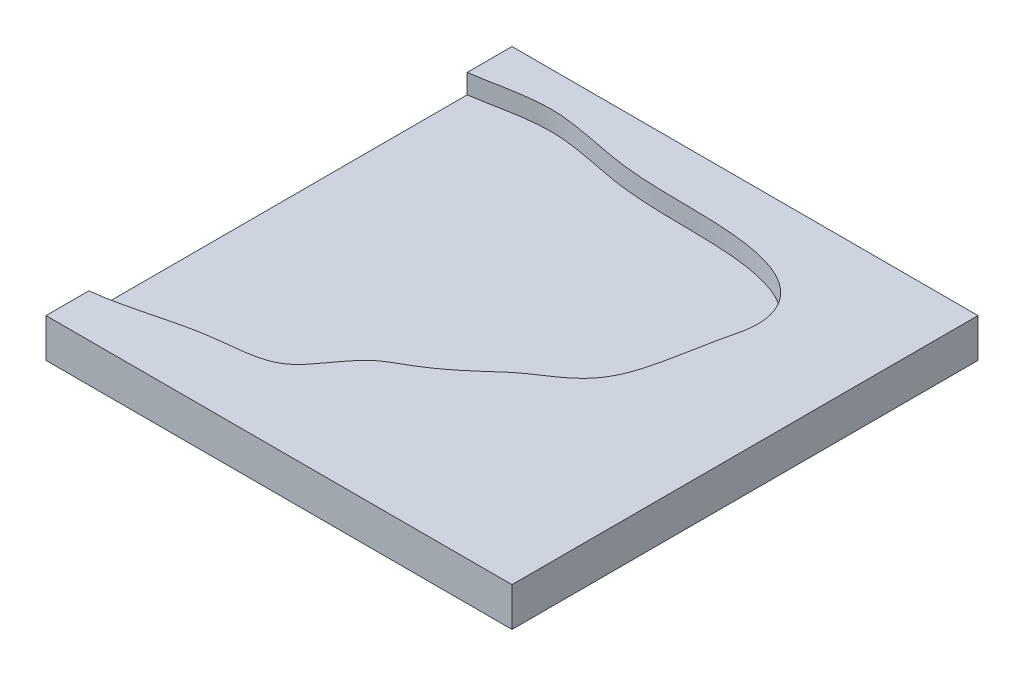
ISO-10303-21;
HEADER;
FILE_DESCRIPTION(('STEP AP214'),'2;1');
FILE_NAME('part.step','',(''),(''),'','','');
FILE_SCHEMA(('AUTOMOTIVE_DESIGN { 1 0 10303 214 1 1 1 1 }'));
ENDSEC;
DATA;
#1=APPLICATION_CONTEXT('core data for automotive mechanical design processes');
#2=APPLICATION_PROTOCOL_DEFINITION('international standard','automotive_design',2000,#1);
#3=PRODUCT_CONTEXT('',#1,'mechanical');
#4=PRODUCT('Part','Part','',(#3));
#5=PRODUCT_RELATED_PRODUCT_CATEGORY('part','',(#4));
#6=PRODUCT_DEFINITION_FORMATION('','',#4);
#7=PRODUCT_DEFINITION_CONTEXT('part definition',#1,'design');
#8=PRODUCT_DEFINITION('design','',#6,#7);
#9=PRODUCT_DEFINITION_SHAPE('','',#8);
#10=(LENGTH_UNIT() NAMED_UNIT(*) SI_UNIT(.MILLI.,.METRE.));
#11=(NAMED_UNIT(*) PLANE_ANGLE_UNIT() SI_UNIT($,.RADIAN.));
#12=(NAMED_UNIT(*) SI_UNIT($,.STERADIAN.) SOLID_ANGLE_UNIT());
#13=UNCERTAINTY_MEASURE_WITH_UNIT(LENGTH_MEASURE(1.E-05),#10,'distance_accuracy_value','');
#14=(GEOMETRIC_REPRESENTATION_CONTEXT(3) GLOBAL_UNCERTAINTY_ASSIGNED_CONTEXT((#13)) GLOBAL_UNIT_ASSIGNED_CONTEXT((#10,
#11,#12)) REPRESENTATION_CONTEXT('',''));
#15=CARTESIAN_POINT('',(0.,0.,0.));
#16=DIRECTION('',(0.,0.,1.));
#17=DIRECTION('',(1.,0.,0.));
#18=AXIS2_PLACEMENT_3D('',#15,#16,#17);
#19=CARTESIAN_POINT('',(-2.6638595554184,10.,149.689917766277));
#20=DIRECTION('',(1.,0.,0.));
#21=DIRECTION('',(0.,0.,-1.));
#22=AXIS2_PLACEMENT_3D('',#19,#20,#21);
#23=PLANE('',#22);
#24=DIRECTION('',(0.,0.,1.));
#25=VECTOR('',#24,1.);
#26=CARTESIAN_POINT('',(-2.6638595554184,10.,149.689917766277));
#27=LINE('',#26,#25);
#28=CARTESIAN_POINT('',(-2.6638595554184,10.,138.643920271503));
#29=VERTEX_POINT('',#28);
#30=CARTESIAN_POINT('',(-2.6638595554184,10.,149.689917766277));
#31=VERTEX_POINT('',#30);
#32=EDGE_CURVE('E89',#29,#31,#27,.T.);
#33=ORIENTED_EDGE('',*,*,#32,.F.);
#34=DIRECTION('',(0.,1.,0.));
#35=VECTOR('',#34,1.);
#36=CARTESIAN_POINT('',(-2.6638595554184,5.,138.643920271503));
#37=LINE('',#36,#35);
#38=CARTESIAN_POINT('',(-2.6638595554184,5.,138.643920271503));
#39=VERTEX_POINT('',#38);
#40=EDGE_CURVE('E53',#39,#29,#37,.T.);
#41=ORIENTED_EDGE('',*,*,#40,.F.);
#42=DIRECTION('',(0.,0.,1.));
#43=VECTOR('',#42,1.);
#44=CARTESIAN_POINT('',(-2.6638595554184,5.,41.2210328084652));
#45=LINE('',#44,#43);
#46=CARTESIAN_POINT('',(-2.6638595554184,5.,41.2210328084652));
#47=VERTEX_POINT('',#46);
#48=EDGE_CURVE('E137',#47,#39,#45,.T.);
#49=ORIENTED_EDGE('',*,*,#48,.F.);
#50=DIRECTION('',(0.,1.,0.));
#51=VECTOR('',#50,1.);
#52=CARTESIAN_POINT('',(-2.6638595554184,5.,41.2210328084652));
#53=LINE('',#52,#51);
#54=CARTESIAN_POINT('',(-2.6638595554184,10.,41.2210328084652));
#55=VERTEX_POINT('',#54);
#56=EDGE_CURVE('E206',#47,#55,#53,.T.);
#57=ORIENTED_EDGE('',*,*,#56,.T.);
#58=CARTESIAN_POINT('',(-2.6638595554184,10.,29.6899177662766));
#59=VERTEX_POINT('',#58);
#60=EDGE_CURVE('E214',#59,#55,#27,.T.);
#61=ORIENTED_EDGE('',*,*,#60,.F.);
#62=DIRECTION('',(0.,-1.,0.));
#63=VECTOR('',#62,1.);
#64=CARTESIAN_POINT('',(-2.6638595554184,10.,29.6899177662766));
#65=LINE('',#64,#63);
#66=CARTESIAN_POINT('',(-2.6638595554184,0.,29.6899177662766));
#67=VERTEX_POINT('',#66);
#68=EDGE_CURVE('E193',#59,#67,#65,.T.);
#69=ORIENTED_EDGE('',*,*,#68,.T.);
#70=DIRECTION('',(0.,0.,1.));
#71=VECTOR('',#70,1.);
#72=CARTESIAN_POINT('',(-2.6638595554184,0.,149.689917766277));
#73=LINE('',#72,#71);
#74=CARTESIAN_POINT('',(-2.6638595554184,0.,149.689917766277));
#75=VERTEX_POINT('',#74);
#76=EDGE_CURVE('E181',#67,#75,#73,.T.);
#77=ORIENTED_EDGE('',*,*,#76,.T.);
#78=DIRECTION('',(0.,-1.,0.));
#79=VECTOR('',#78,1.);
#80=CARTESIAN_POINT('',(-2.6638595554184,10.,149.689917766277));
#81=LINE('',#80,#79);
#82=EDGE_CURVE('E11',#31,#75,#81,.T.);
#83=ORIENTED_EDGE('',*,*,#82,.F.);
#84=EDGE_LOOP('',(#33,#41,#49,#57,#61,#69,#77,#83));
#85=FACE_BOUND('',#84,.T.);
#86=ADVANCED_FACE('F38',(#85),#23,.F.);
#87=CARTESIAN_POINT('',(117.336140444582,10.,149.689917766277));
#88=DIRECTION('',(0.,0.,-1.));
#89=DIRECTION('',(-1.,0.,0.));
#90=AXIS2_PLACEMENT_3D('',#87,#88,#89);
#91=PLANE('',#90);
#92=DIRECTION('',(1.,0.,0.));
#93=VECTOR('',#92,1.);
#94=CARTESIAN_POINT('',(117.336140444582,0.,149.689917766277));
#95=LINE('',#94,#93);
#96=CARTESIAN_POINT('',(117.336140444582,0.,149.689917766277));
#97=VERTEX_POINT('',#96);
#98=EDGE_CURVE('E171',#75,#97,#95,.T.);
#99=ORIENTED_EDGE('',*,*,#98,.T.);
#100=DIRECTION('',(0.,-1.,0.));
#101=VECTOR('',#100,1.);
#102=CARTESIAN_POINT('',(117.336140444582,10.,149.689917766277));
#103=LINE('',#102,#101);
#104=CARTESIAN_POINT('',(117.336140444582,10.,149.689917766277));
#105=VERTEX_POINT('',#104);
#106=EDGE_CURVE('E46',#105,#97,#103,.T.);
#107=ORIENTED_EDGE('',*,*,#106,.F.);
#108=DIRECTION('',(1.,0.,0.));
#109=VECTOR('',#108,1.);
#110=CARTESIAN_POINT('',(117.336140444582,10.,149.689917766277));
#111=LINE('',#110,#109);
#112=EDGE_CURVE('E201',#31,#105,#111,.T.);
#113=ORIENTED_EDGE('',*,*,#112,.F.);
#114=ORIENTED_EDGE('',*,*,#82,.T.);
#115=EDGE_LOOP('',(#99,#107,#113,#114));
#116=FACE_BOUND('',#115,.T.);
#117=ADVANCED_FACE('F161',(#116),#91,.F.);
#118=CARTESIAN_POINT('',(117.336140444582,10.,29.6899177662766));
#119=DIRECTION('',(-1.,0.,0.));
#120=DIRECTION('',(0.,0.,1.));
#121=AXIS2_PLACEMENT_3D('',#118,#119,#120);
#122=PLANE('',#121);
#123=DIRECTION('',(0.,0.,-1.));
#124=VECTOR('',#123,1.);
#125=CARTESIAN_POINT('',(117.336140444582,0.,29.6899177662766));
#126=LINE('',#125,#124);
#127=CARTESIAN_POINT('',(117.336140444582,0.,29.6899177662766));
#128=VERTEX_POINT('',#127);
#129=EDGE_CURVE('E180',#97,#128,#126,.T.);
#130=ORIENTED_EDGE('',*,*,#129,.T.);
#131=DIRECTION('',(0.,-1.,0.));
#132=VECTOR('',#131,1.);
#133=CARTESIAN_POINT('',(117.336140444582,10.,29.6899177662766));
#134=LINE('',#133,#132);
#135=CARTESIAN_POINT('',(117.336140444582,10.,29.6899177662766));
#136=VERTEX_POINT('',#135);
#137=EDGE_CURVE('E186',#136,#128,#134,.T.);
#138=ORIENTED_EDGE('',*,*,#137,.F.);
#139=DIRECTION('',(0.,0.,-1.));
#140=VECTOR('',#139,1.);
#141=CARTESIAN_POINT('',(117.336140444582,10.,29.6899177662766));
#142=LINE('',#141,#140);
#143=EDGE_CURVE('E184',#105,#136,#142,.T.);
#144=ORIENTED_EDGE('',*,*,#143,.F.);
#145=ORIENTED_EDGE('',*,*,#106,.T.);
#146=EDGE_LOOP('',(#130,#138,#144,#145));
#147=FACE_BOUND('',#146,.T.);
#148=ADVANCED_FACE('F159',(#147),#122,.F.);
#149=CARTESIAN_POINT('',(-2.6638595554184,10.,29.6899177662766));
#150=DIRECTION('',(0.,0.,1.));
#151=DIRECTION('',(1.,0.,0.));
#152=AXIS2_PLACEMENT_3D('',#149,#150,#151);
#153=PLANE('',#152);
#154=DIRECTION('',(-1.,0.,0.));
#155=VECTOR('',#154,1.);
#156=CARTESIAN_POINT('',(-2.6638595554184,0.,29.6899177662766));
#157=LINE('',#156,#155);
#158=EDGE_CURVE('E83',#128,#67,#157,.T.);
#159=ORIENTED_EDGE('',*,*,#158,.T.);
#160=ORIENTED_EDGE('',*,*,#68,.F.);
#161=DIRECTION('',(-1.,0.,0.));
#162=VECTOR('',#161,1.);
#163=CARTESIAN_POINT('',(-2.6638595554184,10.,29.6899177662766));
#164=LINE('',#163,#162);
#165=EDGE_CURVE('E62',#136,#59,#164,.T.);
#166=ORIENTED_EDGE('',*,*,#165,.F.);
#167=ORIENTED_EDGE('',*,*,#137,.T.);
#168=EDGE_LOOP('',(#159,#160,#166,#167));
#169=FACE_BOUND('',#168,.T.);
#170=ADVANCED_FACE('F153',(#169),#153,.F.);
#171=CARTESIAN_POINT('',(0.,10.,0.));
#172=DIRECTION('',(0.,-1.,0.));
#173=DIRECTION('',(0.,0.,-1.));
#174=AXIS2_PLACEMENT_3D('',#171,#172,#173);
#175=PLANE('',#174);
#176=ORIENTED_EDGE('',*,*,#60,.T.);
#177=CARTESIAN_POINT('',(-2.66385955541865,10.,138.643920271503));
#178=CARTESIAN_POINT('',(5.7569462701769,10.,137.747753923947));
#179=CARTESIAN_POINT('',(16.0098327856984,10.,133.868551103013));
#180=CARTESIAN_POINT('',(33.034149123482,10.,132.147753258948));
#181=CARTESIAN_POINT('',(41.0159965496309,10.,130.652416152048));
#182=CARTESIAN_POINT('',(46.9509345721601,10.,118.429256318146));
#183=CARTESIAN_POINT('',(59.2575063122146,10.,111.938966377022));
#184=CARTESIAN_POINT('',(64.9765533165873,10.,106.817997229467));
#185=CARTESIAN_POINT('',(74.3391056759786,10.,98.3953228430289));
#186=CARTESIAN_POINT('',(85.643137690505,10.,94.5902785440997));
#187=CARTESIAN_POINT('',(88.2776931244631,10.,72.1561510164799));
#188=CARTESIAN_POINT('',(92.0619054690025,10.,58.1756281555409));
#189=CARTESIAN_POINT('',(86.602392347117,10.,45.3775902146767));
#190=CARTESIAN_POINT('',(63.3358225233786,10.,41.9485556315241));
#191=CARTESIAN_POINT('',(38.9105013621042,10.,43.2358169961284));
#192=CARTESIAN_POINT('',(16.3404572535223,10.,36.6754768121397));
#193=CARTESIAN_POINT('',(3.35345348743094,10.,40.4166460424263));
#194=CARTESIAN_POINT('',(-2.6638595554184,10.,41.2210328084652));
#195=B_SPLINE_CURVE_WITH_KNOTS('',3,(#177,#178,#179,#180,#181,#182,#183,#184,#185,#186,#187,
#188,#189,#190,#191,#192,#193,#194),.UNSPECIFIED.,.F.,.F.,(4,1,1,1,1,1,1,1,1,1,1,1,1,1,1,4),(0.,
0.069346514666055,0.0833126645881126,0.139661499220577,0.193098150689348,0.207928453126904,
0.279071626877332,0.299564958920167,0.403968876836447,0.479456098276815,0.496397248023076,
0.573380374299052,0.698644385274712,0.815912016807029,0.905584376095716,1.),.UNSPECIFIED.);
#196=EDGE_CURVE('E129',#29,#55,#195,.T.);
#197=ORIENTED_EDGE('',*,*,#196,.F.);
#198=ORIENTED_EDGE('',*,*,#32,.T.);
#199=ORIENTED_EDGE('',*,*,#112,.T.);
#200=ORIENTED_EDGE('',*,*,#143,.T.);
#201=ORIENTED_EDGE('',*,*,#165,.T.);
#202=EDGE_LOOP('',(#176,#197,#198,#199,#200,#201));
#203=FACE_BOUND('',#202,.T.);
#204=ADVANCED_FACE('F150',(#203),#175,.F.);
#205=CARTESIAN_POINT('',(0.,0.,0.));
#206=DIRECTION('',(0.,-1.,0.));
#207=DIRECTION('',(0.,0.,-1.));
#208=AXIS2_PLACEMENT_3D('',#205,#206,#207);
#209=PLANE('',#208);
#210=CARTESIAN_POINT('',(57.3361404445816,0.,69.6899177662765));
#211=DIRECTION('',(0.,-1.,0.));
#212=DIRECTION('',(0.,0.,-1.));
#213=AXIS2_PLACEMENT_3D('',#210,#211,#212);
#214=CIRCLE('',#213,1.55);
#215=CARTESIAN_POINT('',(57.3361404445816,0.,68.1399177662765));
#216=VERTEX_POINT('',#215);
#217=EDGE_CURVE('E116',#216,#216,#214,.T.);
#218=ORIENTED_EDGE('',*,*,#217,.F.);
#219=EDGE_LOOP('',(#218));
#220=FACE_BOUND('',#219,.T.);
#221=CARTESIAN_POINT('',(57.3361404445816,0.,109.689917766277));
#222=DIRECTION('',(0.,-1.,0.));
#223=DIRECTION('',(0.,0.,-1.));
#224=AXIS2_PLACEMENT_3D('',#221,#222,#223);
#225=CIRCLE('',#224,1.55);
#226=CARTESIAN_POINT('',(57.3361404445816,0.,108.139917766277));
#227=VERTEX_POINT('',#226);
#228=EDGE_CURVE('E115',#227,#227,#225,.T.);
#229=ORIENTED_EDGE('',*,*,#228,.F.);
#230=EDGE_LOOP('',(#229));
#231=FACE_BOUND('',#230,.T.);
#232=ORIENTED_EDGE('',*,*,#76,.F.);
#233=ORIENTED_EDGE('',*,*,#158,.F.);
#234=ORIENTED_EDGE('',*,*,#129,.F.);
#235=ORIENTED_EDGE('',*,*,#98,.F.);
#236=EDGE_LOOP('',(#232,#233,#234,#235));
#237=FACE_BOUND('',#236,.T.);
#238=ADVANCED_FACE('F148',(#220,#231,#237),#209,.T.);
#239=CARTESIAN_POINT('',(-2.66385955541865,5.,138.643920271503));
#240=CARTESIAN_POINT('',(5.7569462701769,5.,137.747753923947));
#241=CARTESIAN_POINT('',(16.0098327856984,5.,133.868551103013));
#242=CARTESIAN_POINT('',(33.034149123482,5.,132.147753258948));
#243=CARTESIAN_POINT('',(41.0159965496309,5.,130.652416152048));
#244=CARTESIAN_POINT('',(46.9509345721601,5.,118.429256318146));
#245=CARTESIAN_POINT('',(59.2575063122146,5.,111.938966377022));
#246=CARTESIAN_POINT('',(64.9765533165873,5.,106.817997229467));
#247=CARTESIAN_POINT('',(74.3391056759786,5.,98.3953228430289));
#248=CARTESIAN_POINT('',(85.643137690505,5.,94.5902785440997));
#249=CARTESIAN_POINT('',(88.2776931244631,5.,72.1561510164799));
#250=CARTESIAN_POINT('',(92.0619054690025,5.,58.1756281555409));
#251=CARTESIAN_POINT('',(86.602392347117,5.,45.3775902146767));
#252=CARTESIAN_POINT('',(63.3358225233786,5.,41.9485556315241));
#253=CARTESIAN_POINT('',(38.9105013621042,5.,43.2358169961284));
#254=CARTESIAN_POINT('',(16.3404572535223,5.,36.6754768121397));
#255=CARTESIAN_POINT('',(3.35345348743094,5.,40.4166460424263));
#256=CARTESIAN_POINT('',(-2.6638595554184,5.,41.2210328084652));
#257=B_SPLINE_CURVE_WITH_KNOTS('',3,(#239,#240,#241,#242,#243,#244,#245,#246,#247,#248,#249,
#250,#251,#252,#253,#254,#255,#256),.UNSPECIFIED.,.F.,.F.,(4,1,1,1,1,1,1,1,1,1,1,1,1,1,1,4),(0.,
0.069346514666055,0.0833126645881126,0.139661499220577,0.193098150689348,0.207928453126904,
0.279071626877332,0.299564958920167,0.403968876836447,0.479456098276815,0.496397248023076,
0.573380374299052,0.698644385274712,0.815912016807029,0.905584376095716,1.),.UNSPECIFIED.);
#258=DIRECTION('',(0.,1.,0.));
#259=VECTOR('',#258,1.);
#260=SURFACE_OF_LINEAR_EXTRUSION('',#257,#259);
#261=ORIENTED_EDGE('',*,*,#196,.T.);
#262=ORIENTED_EDGE('',*,*,#56,.F.);
#263=EDGE_CURVE('E130',#39,#47,#257,.T.);
#264=ORIENTED_EDGE('',*,*,#263,.F.);
#265=ORIENTED_EDGE('',*,*,#40,.T.);
#266=EDGE_LOOP('',(#261,#262,#264,#265));
#267=FACE_BOUND('',#266,.T.);
#268=ADVANCED_FACE('F143',(#267),#260,.F.);
#269=CARTESIAN_POINT('',(90.7062561758971,5.,62.3693908311258));
#270=DIRECTION('',(0.,-1.,0.));
#271=DIRECTION('',(0.,0.,-1.));
#272=AXIS2_PLACEMENT_3D('',#269,#270,#271);
#273=PLANE('',#272);
#274=ORIENTED_EDGE('',*,*,#263,.T.);
#275=ORIENTED_EDGE('',*,*,#48,.T.);
#276=EDGE_LOOP('',(#274,#275));
#277=FACE_BOUND('',#276,.T.);
#278=ADVANCED_FACE('F147',(#277),#273,.F.);
#279=CARTESIAN_POINT('',(57.3361404445816,4.,109.689917766277));
#280=DIRECTION('',(0.,-1.,0.));
#281=DIRECTION('',(0.,0.,-1.));
#282=AXIS2_PLACEMENT_3D('',#279,#280,#281);
#283=CONICAL_SURFACE('',#282,1.55,1.02974425867665);
#284=CARTESIAN_POINT('',(57.3361404445816,4.93133395949272,109.689917766277));
#285=VERTEX_POINT('',#284);
#286=VERTEX_LOOP('',#285);
#287=FACE_BOUND('',#286,.T.);
#288=CARTESIAN_POINT('',(57.3361404445816,4.,109.689917766277));
#289=DIRECTION('',(0.,-1.,0.));
#290=DIRECTION('',(0.,0.,-1.));
#291=AXIS2_PLACEMENT_3D('',#288,#289,#290);
#292=CIRCLE('',#291,1.55);
#293=CARTESIAN_POINT('',(57.3361404445816,4.,108.139917766277));
#294=VERTEX_POINT('',#293);
#295=EDGE_CURVE('E121',#294,#294,#292,.T.);
#296=ORIENTED_EDGE('',*,*,#295,.T.);
#297=EDGE_LOOP('',(#296));
#298=FACE_BOUND('',#297,.T.);
#299=ADVANCED_FACE('F224',(#287,#298),#283,.F.);
#300=CARTESIAN_POINT('',(57.3361404445816,0.,109.689917766277));
#301=DIRECTION('',(0.,-1.,0.));
#302=DIRECTION('',(0.,0.,-1.));
#303=AXIS2_PLACEMENT_3D('',#300,#301,#302);
#304=CYLINDRICAL_SURFACE('',#303,1.55);
#305=ORIENTED_EDGE('',*,*,#295,.F.);
#306=EDGE_LOOP('',(#305));
#307=FACE_BOUND('',#306,.T.);
#308=ORIENTED_EDGE('',*,*,#228,.T.);
#309=EDGE_LOOP('',(#308));
#310=FACE_BOUND('',#309,.T.);
#311=ADVANCED_FACE('F108',(#307,#310),#304,.F.);
#312=CARTESIAN_POINT('',(57.3361404445816,4.,69.6899177662765));
#313=DIRECTION('',(0.,-1.,0.));
#314=DIRECTION('',(0.,0.,-1.));
#315=AXIS2_PLACEMENT_3D('',#312,#313,#314);
#316=CONICAL_SURFACE('',#315,1.55,1.02974425867665);
#317=CARTESIAN_POINT('',(57.3361404445816,4.93133395949272,69.6899177662765));
#318=VERTEX_POINT('',#317);
#319=VERTEX_LOOP('',#318);
#320=FACE_BOUND('',#319,.T.);
#321=CARTESIAN_POINT('',(57.3361404445816,4.,69.6899177662765));
#322=DIRECTION('',(0.,-1.,0.));
#323=DIRECTION('',(0.,0.,-1.));
#324=AXIS2_PLACEMENT_3D('',#321,#322,#323);
#325=CIRCLE('',#324,1.55);
#326=CARTESIAN_POINT('',(57.3361404445816,4.,68.1399177662765));
#327=VERTEX_POINT('',#326);
#328=EDGE_CURVE('E112',#327,#327,#325,.T.);
#329=ORIENTED_EDGE('',*,*,#328,.T.);
#330=EDGE_LOOP('',(#329));
#331=FACE_BOUND('',#330,.T.);
#332=ADVANCED_FACE('F104',(#320,#331),#316,.F.);
#333=CARTESIAN_POINT('',(57.3361404445816,0.,69.6899177662765));
#334=DIRECTION('',(0.,-1.,0.));
#335=DIRECTION('',(0.,0.,-1.));
#336=AXIS2_PLACEMENT_3D('',#333,#334,#335);
#337=CYLINDRICAL_SURFACE('',#336,1.55);
#338=ORIENTED_EDGE('',*,*,#328,.F.);
#339=EDGE_LOOP('',(#338));
#340=FACE_BOUND('',#339,.T.);
#341=ORIENTED_EDGE('',*,*,#217,.T.);
#342=EDGE_LOOP('',(#341));
#343=FACE_BOUND('',#342,.T.);
#344=ADVANCED_FACE('F107',(#340,#343),#337,.F.);
#345=CLOSED_SHELL('',(#86,#117,#148,#170,#204,#238,#268,#278,#299,#311,#332,#344));
#346=MANIFOLD_SOLID_BREP('B2',#345);
#347=ADVANCED_BREP_SHAPE_REPRESENTATION('',(#18,#346),#14);
#348=SHAPE_DEFINITION_REPRESENTATION(#9,#347);
ENDSEC;
END-ISO-10303-21;
